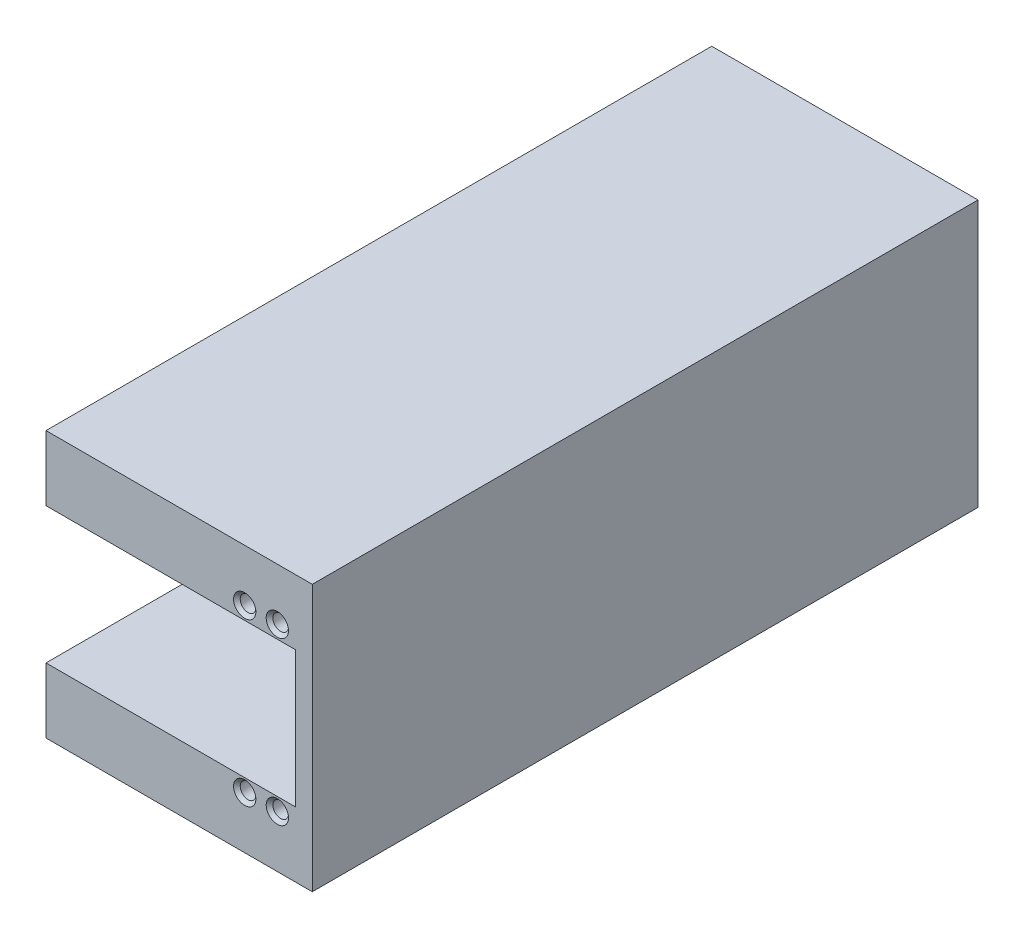
ISO-10303-21;
HEADER;
FILE_DESCRIPTION(('STEP AP214'),'2;1');
FILE_NAME('part.step','',(''),(''),'','','');
FILE_SCHEMA(('AUTOMOTIVE_DESIGN { 1 0 10303 214 1 1 1 1 }'));
ENDSEC;
DATA;
#1=APPLICATION_CONTEXT('core data for automotive mechanical design processes');
#2=APPLICATION_PROTOCOL_DEFINITION('international standard','automotive_design',2000,#1);
#3=PRODUCT_CONTEXT('',#1,'mechanical');
#4=PRODUCT('Part','Part','',(#3));
#5=PRODUCT_RELATED_PRODUCT_CATEGORY('part','',(#4));
#6=PRODUCT_DEFINITION_FORMATION('','',#4);
#7=PRODUCT_DEFINITION_CONTEXT('part definition',#1,'design');
#8=PRODUCT_DEFINITION('design','',#6,#7);
#9=PRODUCT_DEFINITION_SHAPE('','',#8);
#10=(LENGTH_UNIT() NAMED_UNIT(*) SI_UNIT(.MILLI.,.METRE.));
#11=(NAMED_UNIT(*) PLANE_ANGLE_UNIT() SI_UNIT($,.RADIAN.));
#12=(NAMED_UNIT(*) SI_UNIT($,.STERADIAN.) SOLID_ANGLE_UNIT());
#13=UNCERTAINTY_MEASURE_WITH_UNIT(LENGTH_MEASURE(1.E-05),#10,'distance_accuracy_value','');
#14=(GEOMETRIC_REPRESENTATION_CONTEXT(3) GLOBAL_UNCERTAINTY_ASSIGNED_CONTEXT((#13)) GLOBAL_UNIT_ASSIGNED_CONTEXT((#10,
#11,#12)) REPRESENTATION_CONTEXT('',''));
#15=CARTESIAN_POINT('',(0.,0.,0.));
#16=DIRECTION('',(0.,0.,1.));
#17=DIRECTION('',(1.,0.,0.));
#18=AXIS2_PLACEMENT_3D('',#15,#16,#17);
#19=CARTESIAN_POINT('',(40.,-40.,200.));
#20=DIRECTION('',(0.,1.,0.));
#21=DIRECTION('',(0.,0.,1.));
#22=AXIS2_PLACEMENT_3D('',#19,#20,#21);
#23=PLANE('',#22);
#24=DIRECTION('',(1.,0.,0.));
#25=VECTOR('',#24,1.);
#26=CARTESIAN_POINT('',(40.,-40.,0.));
#27=LINE('',#26,#25);
#28=CARTESIAN_POINT('',(-40.,-40.,0.));
#29=VERTEX_POINT('',#28);
#30=CARTESIAN_POINT('',(40.,-40.,0.));
#31=VERTEX_POINT('',#30);
#32=EDGE_CURVE('E139',#29,#31,#27,.T.);
#33=ORIENTED_EDGE('',*,*,#32,.T.);
#34=DIRECTION('',(0.,0.,-1.));
#35=VECTOR('',#34,1.);
#36=CARTESIAN_POINT('',(40.,-40.,200.));
#37=LINE('',#36,#35);
#38=CARTESIAN_POINT('',(40.,-40.,200.));
#39=VERTEX_POINT('',#38);
#40=EDGE_CURVE('E167',#39,#31,#37,.T.);
#41=ORIENTED_EDGE('',*,*,#40,.F.);
#42=DIRECTION('',(1.,0.,0.));
#43=VECTOR('',#42,1.);
#44=CARTESIAN_POINT('',(40.,-40.,200.));
#45=LINE('',#44,#43);
#46=CARTESIAN_POINT('',(-40.,-40.,200.));
#47=VERTEX_POINT('',#46);
#48=EDGE_CURVE('E154',#47,#39,#45,.T.);
#49=ORIENTED_EDGE('',*,*,#48,.F.);
#50=DIRECTION('',(0.,0.,-1.));
#51=VECTOR('',#50,1.);
#52=CARTESIAN_POINT('',(-40.,-40.,200.));
#53=LINE('',#52,#51);
#54=EDGE_CURVE('E135',#47,#29,#53,.T.);
#55=ORIENTED_EDGE('',*,*,#54,.T.);
#56=EDGE_LOOP('',(#33,#41,#49,#55));
#57=FACE_BOUND('',#56,.T.);
#58=ADVANCED_FACE('F40',(#57),#23,.F.);
#59=CARTESIAN_POINT('',(40.,40.,200.));
#60=DIRECTION('',(-1.,0.,0.));
#61=DIRECTION('',(0.,0.,1.));
#62=AXIS2_PLACEMENT_3D('',#59,#60,#61);
#63=PLANE('',#62);
#64=DIRECTION('',(0.,1.,0.));
#65=VECTOR('',#64,1.);
#66=CARTESIAN_POINT('',(40.,40.,0.));
#67=LINE('',#66,#65);
#68=CARTESIAN_POINT('',(40.,40.,0.));
#69=VERTEX_POINT('',#68);
#70=EDGE_CURVE('E142',#31,#69,#67,.T.);
#71=ORIENTED_EDGE('',*,*,#70,.T.);
#72=DIRECTION('',(0.,0.,-1.));
#73=VECTOR('',#72,1.);
#74=CARTESIAN_POINT('',(40.,40.,200.));
#75=LINE('',#74,#73);
#76=CARTESIAN_POINT('',(40.,40.,200.));
#77=VERTEX_POINT('',#76);
#78=EDGE_CURVE('E164',#77,#69,#75,.T.);
#79=ORIENTED_EDGE('',*,*,#78,.F.);
#80=DIRECTION('',(0.,1.,0.));
#81=VECTOR('',#80,1.);
#82=CARTESIAN_POINT('',(40.,40.,200.));
#83=LINE('',#82,#81);
#84=EDGE_CURVE('E102',#39,#77,#83,.T.);
#85=ORIENTED_EDGE('',*,*,#84,.F.);
#86=ORIENTED_EDGE('',*,*,#40,.T.);
#87=EDGE_LOOP('',(#71,#79,#85,#86));
#88=FACE_BOUND('',#87,.T.);
#89=ADVANCED_FACE('F231',(#88),#63,.F.);
#90=CARTESIAN_POINT('',(-40.,40.,200.));
#91=DIRECTION('',(0.,-1.,0.));
#92=DIRECTION('',(0.,0.,-1.));
#93=AXIS2_PLACEMENT_3D('',#90,#91,#92);
#94=PLANE('',#93);
#95=DIRECTION('',(-1.,0.,0.));
#96=VECTOR('',#95,1.);
#97=CARTESIAN_POINT('',(-40.,40.,0.));
#98=LINE('',#97,#96);
#99=CARTESIAN_POINT('',(-40.,40.,0.));
#100=VERTEX_POINT('',#99);
#101=EDGE_CURVE('E145',#69,#100,#98,.T.);
#102=ORIENTED_EDGE('',*,*,#101,.T.);
#103=DIRECTION('',(0.,0.,-1.));
#104=VECTOR('',#103,1.);
#105=CARTESIAN_POINT('',(-40.,40.,200.));
#106=LINE('',#105,#104);
#107=CARTESIAN_POINT('',(-40.,40.,200.));
#108=VERTEX_POINT('',#107);
#109=EDGE_CURVE('E161',#108,#100,#106,.T.);
#110=ORIENTED_EDGE('',*,*,#109,.F.);
#111=DIRECTION('',(-1.,0.,0.));
#112=VECTOR('',#111,1.);
#113=CARTESIAN_POINT('',(-40.,40.,200.));
#114=LINE('',#113,#112);
#115=EDGE_CURVE('E313',#77,#108,#114,.T.);
#116=ORIENTED_EDGE('',*,*,#115,.F.);
#117=ORIENTED_EDGE('',*,*,#78,.T.);
#118=EDGE_LOOP('',(#102,#110,#116,#117));
#119=FACE_BOUND('',#118,.T.);
#120=ADVANCED_FACE('F237',(#119),#94,.F.);
#121=CARTESIAN_POINT('',(-40.,20.45,200.));
#122=DIRECTION('',(1.,0.,0.));
#123=DIRECTION('',(0.,1.,0.));
#124=AXIS2_PLACEMENT_3D('',#121,#122,#123);
#125=PLANE('',#124);
#126=DIRECTION('',(0.,-1.,0.));
#127=VECTOR('',#126,1.);
#128=CARTESIAN_POINT('',(-40.,20.45,0.));
#129=LINE('',#128,#127);
#130=CARTESIAN_POINT('',(-40.,20.45,0.));
#131=VERTEX_POINT('',#130);
#132=EDGE_CURVE('E147',#100,#131,#129,.T.);
#133=ORIENTED_EDGE('',*,*,#132,.T.);
#134=DIRECTION('',(0.,0.,-1.));
#135=VECTOR('',#134,1.);
#136=CARTESIAN_POINT('',(-40.,20.45,200.));
#137=LINE('',#136,#135);
#138=CARTESIAN_POINT('',(-40.,20.45,200.));
#139=VERTEX_POINT('',#138);
#140=EDGE_CURVE('E158',#139,#131,#137,.T.);
#141=ORIENTED_EDGE('',*,*,#140,.F.);
#142=DIRECTION('',(0.,-1.,0.));
#143=VECTOR('',#142,1.);
#144=CARTESIAN_POINT('',(-40.,20.45,200.));
#145=LINE('',#144,#143);
#146=EDGE_CURVE('E315',#108,#139,#145,.T.);
#147=ORIENTED_EDGE('',*,*,#146,.F.);
#148=ORIENTED_EDGE('',*,*,#109,.T.);
#149=EDGE_LOOP('',(#133,#141,#147,#148));
#150=FACE_BOUND('',#149,.T.);
#151=ADVANCED_FACE('F321',(#150),#125,.F.);
#152=CARTESIAN_POINT('',(35.,20.45,200.));
#153=DIRECTION('',(0.,1.,0.));
#154=DIRECTION('',(-1.,0.,0.));
#155=AXIS2_PLACEMENT_3D('',#152,#153,#154);
#156=PLANE('',#155);
#157=DIRECTION('',(1.,0.,0.));
#158=VECTOR('',#157,1.);
#159=CARTESIAN_POINT('',(35.,20.45,0.));
#160=LINE('',#159,#158);
#161=CARTESIAN_POINT('',(35.,20.45,0.));
#162=VERTEX_POINT('',#161);
#163=EDGE_CURVE('E149',#131,#162,#160,.T.);
#164=ORIENTED_EDGE('',*,*,#163,.T.);
#165=DIRECTION('',(0.,0.,-1.));
#166=VECTOR('',#165,1.);
#167=CARTESIAN_POINT('',(35.,20.45,200.));
#168=LINE('',#167,#166);
#169=CARTESIAN_POINT('',(35.,20.45,200.));
#170=VERTEX_POINT('',#169);
#171=EDGE_CURVE('E130',#170,#162,#168,.T.);
#172=ORIENTED_EDGE('',*,*,#171,.F.);
#173=DIRECTION('',(1.,0.,0.));
#174=VECTOR('',#173,1.);
#175=CARTESIAN_POINT('',(35.,20.45,200.));
#176=LINE('',#175,#174);
#177=EDGE_CURVE('E121',#139,#170,#176,.T.);
#178=ORIENTED_EDGE('',*,*,#177,.F.);
#179=ORIENTED_EDGE('',*,*,#140,.T.);
#180=EDGE_LOOP('',(#164,#172,#178,#179));
#181=FACE_BOUND('',#180,.T.);
#182=ADVANCED_FACE('F325',(#181),#156,.F.);
#183=CARTESIAN_POINT('',(35.,-20.45,200.));
#184=DIRECTION('',(1.,0.,0.));
#185=DIRECTION('',(0.,0.,-1.));
#186=AXIS2_PLACEMENT_3D('',#183,#184,#185);
#187=PLANE('',#186);
#188=DIRECTION('',(0.,-1.,0.));
#189=VECTOR('',#188,1.);
#190=CARTESIAN_POINT('',(35.,-20.45,0.));
#191=LINE('',#190,#189);
#192=CARTESIAN_POINT('',(35.,-20.45,0.));
#193=VERTEX_POINT('',#192);
#194=EDGE_CURVE('E129',#162,#193,#191,.T.);
#195=ORIENTED_EDGE('',*,*,#194,.T.);
#196=DIRECTION('',(0.,0.,-1.));
#197=VECTOR('',#196,1.);
#198=CARTESIAN_POINT('',(35.,-20.45,200.));
#199=LINE('',#198,#197);
#200=CARTESIAN_POINT('',(35.,-20.45,200.));
#201=VERTEX_POINT('',#200);
#202=EDGE_CURVE('E126',#201,#193,#199,.T.);
#203=ORIENTED_EDGE('',*,*,#202,.F.);
#204=DIRECTION('',(0.,-1.,0.));
#205=VECTOR('',#204,1.);
#206=CARTESIAN_POINT('',(35.,-20.45,200.));
#207=LINE('',#206,#205);
#208=EDGE_CURVE('E115',#170,#201,#207,.T.);
#209=ORIENTED_EDGE('',*,*,#208,.F.);
#210=ORIENTED_EDGE('',*,*,#171,.T.);
#211=EDGE_LOOP('',(#195,#203,#209,#210));
#212=FACE_BOUND('',#211,.T.);
#213=ADVANCED_FACE('F127',(#212),#187,.F.);
#214=CARTESIAN_POINT('',(-40.,-20.45,200.));
#215=DIRECTION('',(0.,-1.,0.));
#216=DIRECTION('',(1.,0.,0.));
#217=AXIS2_PLACEMENT_3D('',#214,#215,#216);
#218=PLANE('',#217);
#219=DIRECTION('',(-1.,0.,0.));
#220=VECTOR('',#219,1.);
#221=CARTESIAN_POINT('',(-40.,-20.45,0.));
#222=LINE('',#221,#220);
#223=CARTESIAN_POINT('',(-40.,-20.45,0.));
#224=VERTEX_POINT('',#223);
#225=EDGE_CURVE('E87',#193,#224,#222,.T.);
#226=ORIENTED_EDGE('',*,*,#225,.T.);
#227=DIRECTION('',(0.,0.,-1.));
#228=VECTOR('',#227,1.);
#229=CARTESIAN_POINT('',(-40.,-20.45,200.));
#230=LINE('',#229,#228);
#231=CARTESIAN_POINT('',(-40.,-20.45,200.));
#232=VERTEX_POINT('',#231);
#233=EDGE_CURVE('E131',#232,#224,#230,.T.);
#234=ORIENTED_EDGE('',*,*,#233,.F.);
#235=DIRECTION('',(-1.,0.,0.));
#236=VECTOR('',#235,1.);
#237=CARTESIAN_POINT('',(-40.,-20.45,200.));
#238=LINE('',#237,#236);
#239=EDGE_CURVE('E119',#201,#232,#238,.T.);
#240=ORIENTED_EDGE('',*,*,#239,.F.);
#241=ORIENTED_EDGE('',*,*,#202,.T.);
#242=EDGE_LOOP('',(#226,#234,#240,#241));
#243=FACE_BOUND('',#242,.T.);
#244=ADVANCED_FACE('F133',(#243),#218,.F.);
#245=CARTESIAN_POINT('',(-40.,-40.,200.));
#246=DIRECTION('',(1.,0.,0.));
#247=DIRECTION('',(0.,1.,0.));
#248=AXIS2_PLACEMENT_3D('',#245,#246,#247);
#249=PLANE('',#248);
#250=DIRECTION('',(0.,-1.,0.));
#251=VECTOR('',#250,1.);
#252=CARTESIAN_POINT('',(-40.,-40.,0.));
#253=LINE('',#252,#251);
#254=EDGE_CURVE('E93',#224,#29,#253,.T.);
#255=ORIENTED_EDGE('',*,*,#254,.T.);
#256=ORIENTED_EDGE('',*,*,#54,.F.);
#257=DIRECTION('',(0.,-1.,0.));
#258=VECTOR('',#257,1.);
#259=CARTESIAN_POINT('',(-40.,-40.,200.));
#260=LINE('',#259,#258);
#261=EDGE_CURVE('E58',#232,#47,#260,.T.);
#262=ORIENTED_EDGE('',*,*,#261,.F.);
#263=ORIENTED_EDGE('',*,*,#233,.T.);
#264=EDGE_LOOP('',(#255,#256,#262,#263));
#265=FACE_BOUND('',#264,.T.);
#266=ADVANCED_FACE('F332',(#265),#249,.F.);
#267=CARTESIAN_POINT('',(0.,0.,200.));
#268=DIRECTION('',(0.,0.,-1.));
#269=DIRECTION('',(-1.,0.,0.));
#270=AXIS2_PLACEMENT_3D('',#267,#268,#269);
#271=PLANE('',#270);
#272=CARTESIAN_POINT('',(29.4999999999995,-24.3399999999998,200.));
#273=DIRECTION('',(0.,0.,-1.));
#274=DIRECTION('',(-1.,0.,0.));
#275=AXIS2_PLACEMENT_3D('',#272,#273,#274);
#276=CIRCLE('',#275,3.34999999999999);
#277=CARTESIAN_POINT('',(26.1499999999995,-24.3399999999998,200.));
#278=VERTEX_POINT('',#277);
#279=EDGE_CURVE('E205',#278,#278,#276,.T.);
#280=ORIENTED_EDGE('',*,*,#279,.T.);
#281=EDGE_LOOP('',(#280));
#282=FACE_BOUND('',#281,.T.);
#283=CARTESIAN_POINT('',(19.6999999999995,-24.3399999999996,200.));
#284=DIRECTION('',(0.,0.,-1.));
#285=DIRECTION('',(-1.,0.,0.));
#286=AXIS2_PLACEMENT_3D('',#283,#284,#285);
#287=CIRCLE('',#286,3.34999999999999);
#288=CARTESIAN_POINT('',(16.3499999999995,-24.3399999999996,200.));
#289=VERTEX_POINT('',#288);
#290=EDGE_CURVE('E202',#289,#289,#287,.T.);
#291=ORIENTED_EDGE('',*,*,#290,.T.);
#292=EDGE_LOOP('',(#291));
#293=FACE_BOUND('',#292,.T.);
#294=CARTESIAN_POINT('',(19.7,24.34,200.));
#295=DIRECTION('',(0.,0.,-1.));
#296=DIRECTION('',(-1.,0.,0.));
#297=AXIS2_PLACEMENT_3D('',#294,#295,#296);
#298=CIRCLE('',#297,3.34999999999999);
#299=CARTESIAN_POINT('',(16.35,24.34,200.));
#300=VERTEX_POINT('',#299);
#301=EDGE_CURVE('E199',#300,#300,#298,.T.);
#302=ORIENTED_EDGE('',*,*,#301,.T.);
#303=EDGE_LOOP('',(#302));
#304=FACE_BOUND('',#303,.T.);
#305=CARTESIAN_POINT('',(29.5,24.34,200.));
#306=DIRECTION('',(0.,0.,-1.));
#307=DIRECTION('',(-1.,0.,0.));
#308=AXIS2_PLACEMENT_3D('',#305,#306,#307);
#309=CIRCLE('',#308,3.34999999999999);
#310=CARTESIAN_POINT('',(26.15,24.34,200.));
#311=VERTEX_POINT('',#310);
#312=EDGE_CURVE('E196',#311,#311,#309,.T.);
#313=ORIENTED_EDGE('',*,*,#312,.T.);
#314=EDGE_LOOP('',(#313));
#315=FACE_BOUND('',#314,.T.);
#316=ORIENTED_EDGE('',*,*,#48,.T.);
#317=ORIENTED_EDGE('',*,*,#84,.T.);
#318=ORIENTED_EDGE('',*,*,#115,.T.);
#319=ORIENTED_EDGE('',*,*,#146,.T.);
#320=ORIENTED_EDGE('',*,*,#177,.T.);
#321=ORIENTED_EDGE('',*,*,#208,.T.);
#322=ORIENTED_EDGE('',*,*,#239,.T.);
#323=ORIENTED_EDGE('',*,*,#261,.T.);
#324=EDGE_LOOP('',(#316,#317,#318,#319,#320,#321,#322,#323));
#325=FACE_BOUND('',#324,.T.);
#326=ADVANCED_FACE('F117',(#282,#293,#304,#315,#325),#271,.F.);
#327=CARTESIAN_POINT('',(0.,0.,0.));
#328=DIRECTION('',(0.,0.,-1.));
#329=DIRECTION('',(-1.,0.,0.));
#330=AXIS2_PLACEMENT_3D('',#327,#328,#329);
#331=PLANE('',#330);
#332=CARTESIAN_POINT('',(19.6999999999995,-24.3399999999996,0.));
#333=DIRECTION('',(0.,0.,-1.));
#334=DIRECTION('',(-1.,0.,0.));
#335=AXIS2_PLACEMENT_3D('',#332,#333,#334);
#336=CIRCLE('',#335,3.34999999999999);
#337=CARTESIAN_POINT('',(16.3499999999995,-24.3399999999996,0.));
#338=VERTEX_POINT('',#337);
#339=EDGE_CURVE('E181',#338,#338,#336,.F.);
#340=ORIENTED_EDGE('',*,*,#339,.T.);
#341=EDGE_LOOP('',(#340));
#342=FACE_BOUND('',#341,.T.);
#343=CARTESIAN_POINT('',(29.4999999999995,-24.3399999999998,0.));
#344=DIRECTION('',(0.,0.,-1.));
#345=DIRECTION('',(-1.,0.,0.));
#346=AXIS2_PLACEMENT_3D('',#343,#344,#345);
#347=CIRCLE('',#346,3.34999999999996);
#348=CARTESIAN_POINT('',(26.1499999999995,-24.3399999999998,0.));
#349=VERTEX_POINT('',#348);
#350=EDGE_CURVE('E178',#349,#349,#347,.F.);
#351=ORIENTED_EDGE('',*,*,#350,.T.);
#352=EDGE_LOOP('',(#351));
#353=FACE_BOUND('',#352,.T.);
#354=CARTESIAN_POINT('',(29.5,24.34,0.));
#355=DIRECTION('',(0.,0.,-1.));
#356=DIRECTION('',(-1.,0.,0.));
#357=AXIS2_PLACEMENT_3D('',#354,#355,#356);
#358=CIRCLE('',#357,3.35000000000005);
#359=CARTESIAN_POINT('',(26.15,24.34,0.));
#360=VERTEX_POINT('',#359);
#361=EDGE_CURVE('E175',#360,#360,#358,.F.);
#362=ORIENTED_EDGE('',*,*,#361,.T.);
#363=EDGE_LOOP('',(#362));
#364=FACE_BOUND('',#363,.T.);
#365=CARTESIAN_POINT('',(19.7,24.34,0.));
#366=DIRECTION('',(0.,0.,-1.));
#367=DIRECTION('',(-1.,0.,0.));
#368=AXIS2_PLACEMENT_3D('',#365,#366,#367);
#369=CIRCLE('',#368,3.34999999999999);
#370=CARTESIAN_POINT('',(16.35,24.34,0.));
#371=VERTEX_POINT('',#370);
#372=EDGE_CURVE('E172',#371,#371,#369,.F.);
#373=ORIENTED_EDGE('',*,*,#372,.T.);
#374=EDGE_LOOP('',(#373));
#375=FACE_BOUND('',#374,.T.);
#376=ORIENTED_EDGE('',*,*,#32,.F.);
#377=ORIENTED_EDGE('',*,*,#254,.F.);
#378=ORIENTED_EDGE('',*,*,#225,.F.);
#379=ORIENTED_EDGE('',*,*,#194,.F.);
#380=ORIENTED_EDGE('',*,*,#163,.F.);
#381=ORIENTED_EDGE('',*,*,#132,.F.);
#382=ORIENTED_EDGE('',*,*,#101,.F.);
#383=ORIENTED_EDGE('',*,*,#70,.F.);
#384=EDGE_LOOP('',(#376,#377,#378,#379,#380,#381,#382,#383));
#385=FACE_BOUND('',#384,.T.);
#386=ADVANCED_FACE('F328',(#342,#353,#364,#375,#385),#331,.T.);
#387=CARTESIAN_POINT('',(29.5,24.34,192.));
#388=DIRECTION('',(0.,0.,1.));
#389=DIRECTION('',(1.,0.,0.));
#390=AXIS2_PLACEMENT_3D('',#387,#388,#389);
#391=CYLINDRICAL_SURFACE('',#390,2.35);
#392=CARTESIAN_POINT('',(29.5,24.34,199.));
#393=DIRECTION('',(0.,0.,-1.));
#394=DIRECTION('',(-1.,0.,0.));
#395=AXIS2_PLACEMENT_3D('',#392,#393,#394);
#396=CIRCLE('',#395,2.35);
#397=CARTESIAN_POINT('',(27.15,24.34,199.));
#398=VERTEX_POINT('',#397);
#399=EDGE_CURVE('E11',#398,#398,#396,.F.);
#400=ORIENTED_EDGE('',*,*,#399,.T.);
#401=EDGE_LOOP('',(#400));
#402=FACE_BOUND('',#401,.T.);
#403=CARTESIAN_POINT('',(29.5,24.34,192.));
#404=DIRECTION('',(0.,0.,1.));
#405=DIRECTION('',(1.,0.,0.));
#406=AXIS2_PLACEMENT_3D('',#403,#404,#405);
#407=CIRCLE('',#406,2.35);
#408=CARTESIAN_POINT('',(31.85,24.34,192.));
#409=VERTEX_POINT('',#408);
#410=EDGE_CURVE('E143',#409,#409,#407,.T.);
#411=ORIENTED_EDGE('',*,*,#410,.F.);
#412=EDGE_LOOP('',(#411));
#413=FACE_BOUND('',#412,.T.);
#414=ADVANCED_FACE('F397',(#402,#413),#391,.F.);
#415=CARTESIAN_POINT('',(29.5,24.34,192.));
#416=DIRECTION('',(0.,0.,1.));
#417=DIRECTION('',(1.,0.,0.));
#418=AXIS2_PLACEMENT_3D('',#415,#416,#417);
#419=PLANE('',#418);
#420=ORIENTED_EDGE('',*,*,#410,.T.);
#421=EDGE_LOOP('',(#420));
#422=FACE_BOUND('',#421,.T.);
#423=ADVANCED_FACE('F406',(#422),#419,.T.);
#424=CARTESIAN_POINT('',(19.7,24.34,192.));
#425=DIRECTION('',(0.,0.,1.));
#426=DIRECTION('',(1.,0.,0.));
#427=AXIS2_PLACEMENT_3D('',#424,#425,#426);
#428=CYLINDRICAL_SURFACE('',#427,2.35);
#429=CARTESIAN_POINT('',(19.7,24.34,199.));
#430=DIRECTION('',(0.,0.,-1.));
#431=DIRECTION('',(-1.,0.,0.));
#432=AXIS2_PLACEMENT_3D('',#429,#430,#431);
#433=CIRCLE('',#432,2.35);
#434=CARTESIAN_POINT('',(17.35,24.34,199.));
#435=VERTEX_POINT('',#434);
#436=EDGE_CURVE('E50',#435,#435,#433,.F.);
#437=ORIENTED_EDGE('',*,*,#436,.T.);
#438=EDGE_LOOP('',(#437));
#439=FACE_BOUND('',#438,.T.);
#440=CARTESIAN_POINT('',(19.7,24.34,192.));
#441=DIRECTION('',(0.,0.,1.));
#442=DIRECTION('',(-1.,0.,0.));
#443=AXIS2_PLACEMENT_3D('',#440,#441,#442);
#444=CIRCLE('',#443,2.35);
#445=CARTESIAN_POINT('',(17.35,24.34,192.));
#446=VERTEX_POINT('',#445);
#447=EDGE_CURVE('E302',#446,#446,#444,.T.);
#448=ORIENTED_EDGE('',*,*,#447,.F.);
#449=EDGE_LOOP('',(#448));
#450=FACE_BOUND('',#449,.T.);
#451=ADVANCED_FACE('F213',(#439,#450),#428,.F.);
#452=CARTESIAN_POINT('',(19.7,24.34,192.));
#453=DIRECTION('',(0.,0.,-1.));
#454=DIRECTION('',(-1.,0.,0.));
#455=AXIS2_PLACEMENT_3D('',#452,#453,#454);
#456=PLANE('',#455);
#457=ORIENTED_EDGE('',*,*,#447,.T.);
#458=EDGE_LOOP('',(#457));
#459=FACE_BOUND('',#458,.T.);
#460=ADVANCED_FACE('F425',(#459),#456,.F.);
#461=CARTESIAN_POINT('',(19.6999999999995,-24.3399999999996,192.));
#462=DIRECTION('',(0.,0.,1.));
#463=DIRECTION('',(1.,0.,0.));
#464=AXIS2_PLACEMENT_3D('',#461,#462,#463);
#465=CYLINDRICAL_SURFACE('',#464,2.35);
#466=CARTESIAN_POINT('',(19.6999999999995,-24.3399999999996,199.));
#467=DIRECTION('',(0.,0.,-1.));
#468=DIRECTION('',(-1.,0.,0.));
#469=AXIS2_PLACEMENT_3D('',#466,#467,#468);
#470=CIRCLE('',#469,2.35);
#471=CARTESIAN_POINT('',(17.3499999999995,-24.3399999999996,199.));
#472=VERTEX_POINT('',#471);
#473=EDGE_CURVE('E208',#472,#472,#470,.F.);
#474=ORIENTED_EDGE('',*,*,#473,.T.);
#475=EDGE_LOOP('',(#474));
#476=FACE_BOUND('',#475,.T.);
#477=CARTESIAN_POINT('',(19.6999999999995,-24.3399999999996,192.));
#478=DIRECTION('',(0.,0.,1.));
#479=DIRECTION('',(1.,0.,0.));
#480=AXIS2_PLACEMENT_3D('',#477,#478,#479);
#481=CIRCLE('',#480,2.35);
#482=CARTESIAN_POINT('',(22.0499999999995,-24.3399999999996,192.));
#483=VERTEX_POINT('',#482);
#484=EDGE_CURVE('E298',#483,#483,#481,.T.);
#485=ORIENTED_EDGE('',*,*,#484,.F.);
#486=EDGE_LOOP('',(#485));
#487=FACE_BOUND('',#486,.T.);
#488=ADVANCED_FACE('F434',(#476,#487),#465,.F.);
#489=CARTESIAN_POINT('',(19.6999999999995,-24.3399999999996,192.));
#490=DIRECTION('',(0.,0.,1.));
#491=DIRECTION('',(1.,0.,0.));
#492=AXIS2_PLACEMENT_3D('',#489,#490,#491);
#493=PLANE('',#492);
#494=ORIENTED_EDGE('',*,*,#484,.T.);
#495=EDGE_LOOP('',(#494));
#496=FACE_BOUND('',#495,.T.);
#497=ADVANCED_FACE('F292',(#496),#493,.T.);
#498=CARTESIAN_POINT('',(29.4999999999995,-24.3399999999998,192.));
#499=DIRECTION('',(0.,0.,1.));
#500=DIRECTION('',(1.,0.,0.));
#501=AXIS2_PLACEMENT_3D('',#498,#499,#500);
#502=CYLINDRICAL_SURFACE('',#501,2.35);
#503=CARTESIAN_POINT('',(29.4999999999995,-24.3399999999998,199.));
#504=DIRECTION('',(0.,0.,-1.));
#505=DIRECTION('',(-1.,0.,0.));
#506=AXIS2_PLACEMENT_3D('',#503,#504,#505);
#507=CIRCLE('',#506,2.35);
#508=CARTESIAN_POINT('',(27.1499999999995,-24.3399999999998,199.));
#509=VERTEX_POINT('',#508);
#510=EDGE_CURVE('E193',#509,#509,#507,.F.);
#511=ORIENTED_EDGE('',*,*,#510,.T.);
#512=EDGE_LOOP('',(#511));
#513=FACE_BOUND('',#512,.T.);
#514=CARTESIAN_POINT('',(29.4999999999995,-24.3399999999998,192.));
#515=DIRECTION('',(0.,0.,1.));
#516=DIRECTION('',(-1.,0.,0.));
#517=AXIS2_PLACEMENT_3D('',#514,#515,#516);
#518=CIRCLE('',#517,2.35);
#519=CARTESIAN_POINT('',(27.1499999999995,-24.3399999999998,192.));
#520=VERTEX_POINT('',#519);
#521=EDGE_CURVE('E296',#520,#520,#518,.T.);
#522=ORIENTED_EDGE('',*,*,#521,.F.);
#523=EDGE_LOOP('',(#522));
#524=FACE_BOUND('',#523,.T.);
#525=ADVANCED_FACE('F288',(#513,#524),#502,.F.);
#526=CARTESIAN_POINT('',(29.4999999999995,-24.3399999999998,192.));
#527=DIRECTION('',(0.,0.,-1.));
#528=DIRECTION('',(-1.,0.,0.));
#529=AXIS2_PLACEMENT_3D('',#526,#527,#528);
#530=PLANE('',#529);
#531=ORIENTED_EDGE('',*,*,#521,.T.);
#532=EDGE_LOOP('',(#531));
#533=FACE_BOUND('',#532,.T.);
#534=ADVANCED_FACE('F291',(#533),#530,.F.);
#535=CARTESIAN_POINT('',(29.5,24.34,8.));
#536=DIRECTION('',(0.,0.,-1.));
#537=DIRECTION('',(-1.,0.,0.));
#538=AXIS2_PLACEMENT_3D('',#535,#536,#537);
#539=CYLINDRICAL_SURFACE('',#538,2.35);
#540=CARTESIAN_POINT('',(29.5,24.34,1.00000000000003));
#541=DIRECTION('',(0.,0.,-1.));
#542=DIRECTION('',(-1.,0.,0.));
#543=AXIS2_PLACEMENT_3D('',#540,#541,#542);
#544=CIRCLE('',#543,2.35);
#545=CARTESIAN_POINT('',(27.15,24.34,1.00000000000003));
#546=VERTEX_POINT('',#545);
#547=EDGE_CURVE('E187',#546,#546,#544,.T.);
#548=ORIENTED_EDGE('',*,*,#547,.T.);
#549=EDGE_LOOP('',(#548));
#550=FACE_BOUND('',#549,.T.);
#551=CARTESIAN_POINT('',(29.5,24.34,8.));
#552=DIRECTION('',(0.,0.,-1.));
#553=DIRECTION('',(-1.,0.,0.));
#554=AXIS2_PLACEMENT_3D('',#551,#552,#553);
#555=CIRCLE('',#554,2.35);
#556=CARTESIAN_POINT('',(27.15,24.34,8.));
#557=VERTEX_POINT('',#556);
#558=EDGE_CURVE('E299',#557,#557,#555,.T.);
#559=ORIENTED_EDGE('',*,*,#558,.F.);
#560=EDGE_LOOP('',(#559));
#561=FACE_BOUND('',#560,.T.);
#562=ADVANCED_FACE('F468',(#550,#561),#539,.F.);
#563=CARTESIAN_POINT('',(29.5,24.34,8.));
#564=DIRECTION('',(0.,0.,-1.));
#565=DIRECTION('',(-1.,0.,0.));
#566=AXIS2_PLACEMENT_3D('',#563,#564,#565);
#567=PLANE('',#566);
#568=ORIENTED_EDGE('',*,*,#558,.T.);
#569=EDGE_LOOP('',(#568));
#570=FACE_BOUND('',#569,.T.);
#571=ADVANCED_FACE('F477',(#570),#567,.T.);
#572=CARTESIAN_POINT('',(19.7,24.34,8.));
#573=DIRECTION('',(0.,0.,-1.));
#574=DIRECTION('',(-1.,0.,0.));
#575=AXIS2_PLACEMENT_3D('',#572,#573,#574);
#576=CYLINDRICAL_SURFACE('',#575,2.35);
#577=CARTESIAN_POINT('',(19.7,24.34,0.999999999999971));
#578=DIRECTION('',(0.,0.,-1.));
#579=DIRECTION('',(-1.,0.,0.));
#580=AXIS2_PLACEMENT_3D('',#577,#578,#579);
#581=CIRCLE('',#580,2.35);
#582=CARTESIAN_POINT('',(17.35,24.34,0.999999999999971));
#583=VERTEX_POINT('',#582);
#584=EDGE_CURVE('E190',#583,#583,#581,.T.);
#585=ORIENTED_EDGE('',*,*,#584,.T.);
#586=EDGE_LOOP('',(#585));
#587=FACE_BOUND('',#586,.T.);
#588=CARTESIAN_POINT('',(19.7,24.34,8.));
#589=DIRECTION('',(0.,0.,-1.));
#590=DIRECTION('',(1.,0.,0.));
#591=AXIS2_PLACEMENT_3D('',#588,#589,#590);
#592=CIRCLE('',#591,2.35);
#593=CARTESIAN_POINT('',(22.05,24.34,8.));
#594=VERTEX_POINT('',#593);
#595=EDGE_CURVE('E305',#594,#594,#592,.T.);
#596=ORIENTED_EDGE('',*,*,#595,.F.);
#597=EDGE_LOOP('',(#596));
#598=FACE_BOUND('',#597,.T.);
#599=ADVANCED_FACE('F487',(#587,#598),#576,.F.);
#600=CARTESIAN_POINT('',(19.7,24.34,8.));
#601=DIRECTION('',(0.,0.,1.));
#602=DIRECTION('',(1.,0.,0.));
#603=AXIS2_PLACEMENT_3D('',#600,#601,#602);
#604=PLANE('',#603);
#605=ORIENTED_EDGE('',*,*,#595,.T.);
#606=EDGE_LOOP('',(#605));
#607=FACE_BOUND('',#606,.T.);
#608=ADVANCED_FACE('F497',(#607),#604,.F.);
#609=CARTESIAN_POINT('',(19.6999999999995,-24.3399999999996,8.));
#610=DIRECTION('',(0.,0.,-1.));
#611=DIRECTION('',(-1.,0.,0.));
#612=AXIS2_PLACEMENT_3D('',#609,#610,#611);
#613=CYLINDRICAL_SURFACE('',#612,2.35);
#614=CARTESIAN_POINT('',(19.6999999999995,-24.3399999999996,0.999999999999971));
#615=DIRECTION('',(0.,0.,-1.));
#616=DIRECTION('',(-1.,0.,0.));
#617=AXIS2_PLACEMENT_3D('',#614,#615,#616);
#618=CIRCLE('',#617,2.35);
#619=CARTESIAN_POINT('',(17.3499999999995,-24.3399999999996,0.999999999999971));
#620=VERTEX_POINT('',#619);
#621=EDGE_CURVE('E169',#620,#620,#618,.T.);
#622=ORIENTED_EDGE('',*,*,#621,.T.);
#623=EDGE_LOOP('',(#622));
#624=FACE_BOUND('',#623,.T.);
#625=CARTESIAN_POINT('',(19.6999999999995,-24.3399999999996,8.));
#626=DIRECTION('',(0.,0.,-1.));
#627=DIRECTION('',(-1.,0.,0.));
#628=AXIS2_PLACEMENT_3D('',#625,#626,#627);
#629=CIRCLE('',#628,2.35);
#630=CARTESIAN_POINT('',(17.3499999999995,-24.3399999999996,8.));
#631=VERTEX_POINT('',#630);
#632=EDGE_CURVE('E595',#631,#631,#629,.T.);
#633=ORIENTED_EDGE('',*,*,#632,.F.);
#634=EDGE_LOOP('',(#633));
#635=FACE_BOUND('',#634,.T.);
#636=ADVANCED_FACE('F507',(#624,#635),#613,.F.);
#637=CARTESIAN_POINT('',(19.6999999999995,-24.3399999999996,8.));
#638=DIRECTION('',(0.,0.,-1.));
#639=DIRECTION('',(-1.,0.,0.));
#640=AXIS2_PLACEMENT_3D('',#637,#638,#639);
#641=PLANE('',#640);
#642=ORIENTED_EDGE('',*,*,#632,.T.);
#643=EDGE_LOOP('',(#642));
#644=FACE_BOUND('',#643,.T.);
#645=ADVANCED_FACE('F517',(#644),#641,.T.);
#646=CARTESIAN_POINT('',(29.4999999999995,-24.3399999999998,8.));
#647=DIRECTION('',(0.,0.,-1.));
#648=DIRECTION('',(-1.,0.,0.));
#649=AXIS2_PLACEMENT_3D('',#646,#647,#648);
#650=CYLINDRICAL_SURFACE('',#649,2.35);
#651=CARTESIAN_POINT('',(29.4999999999995,-24.3399999999998,0.999999999999973));
#652=DIRECTION('',(0.,0.,-1.));
#653=DIRECTION('',(-1.,0.,0.));
#654=AXIS2_PLACEMENT_3D('',#651,#652,#653);
#655=CIRCLE('',#654,2.35);
#656=CARTESIAN_POINT('',(27.1499999999995,-24.3399999999998,0.999999999999973));
#657=VERTEX_POINT('',#656);
#658=EDGE_CURVE('E184',#657,#657,#655,.T.);
#659=ORIENTED_EDGE('',*,*,#658,.T.);
#660=EDGE_LOOP('',(#659));
#661=FACE_BOUND('',#660,.T.);
#662=CARTESIAN_POINT('',(29.4999999999995,-24.3399999999998,8.));
#663=DIRECTION('',(0.,0.,-1.));
#664=DIRECTION('',(1.,0.,0.));
#665=AXIS2_PLACEMENT_3D('',#662,#663,#664);
#666=CIRCLE('',#665,2.35);
#667=CARTESIAN_POINT('',(31.8499999999995,-24.3399999999998,8.));
#668=VERTEX_POINT('',#667);
#669=EDGE_CURVE('E593',#668,#668,#666,.T.);
#670=ORIENTED_EDGE('',*,*,#669,.F.);
#671=EDGE_LOOP('',(#670));
#672=FACE_BOUND('',#671,.T.);
#673=ADVANCED_FACE('F527',(#661,#672),#650,.F.);
#674=CARTESIAN_POINT('',(29.4999999999995,-24.3399999999998,8.));
#675=DIRECTION('',(0.,0.,1.));
#676=DIRECTION('',(1.,0.,0.));
#677=AXIS2_PLACEMENT_3D('',#674,#675,#676);
#678=PLANE('',#677);
#679=ORIENTED_EDGE('',*,*,#669,.T.);
#680=EDGE_LOOP('',(#679));
#681=FACE_BOUND('',#680,.T.);
#682=ADVANCED_FACE('F249',(#681),#678,.F.);
#683=CARTESIAN_POINT('',(19.6999999999995,-24.3399999999996,0.999999999999971));
#684=DIRECTION('',(0.,0.,-1.));
#685=DIRECTION('',(-1.,0.,0.));
#686=AXIS2_PLACEMENT_3D('',#683,#684,#685);
#687=CONICAL_SURFACE('',#686,2.35,0.785398163397458);
#688=ORIENTED_EDGE('',*,*,#339,.F.);
#689=EDGE_LOOP('',(#688));
#690=FACE_BOUND('',#689,.T.);
#691=ORIENTED_EDGE('',*,*,#621,.F.);
#692=EDGE_LOOP('',(#691));
#693=FACE_BOUND('',#692,.T.);
#694=ADVANCED_FACE('F242',(#690,#693),#687,.F.);
#695=CARTESIAN_POINT('',(29.4999999999995,-24.3399999999998,0.999999999999973));
#696=DIRECTION('',(0.,0.,-1.));
#697=DIRECTION('',(-1.,0.,0.));
#698=AXIS2_PLACEMENT_3D('',#695,#696,#697);
#699=CONICAL_SURFACE('',#698,2.35,0.785398163397444);
#700=ORIENTED_EDGE('',*,*,#350,.F.);
#701=EDGE_LOOP('',(#700));
#702=FACE_BOUND('',#701,.T.);
#703=ORIENTED_EDGE('',*,*,#658,.F.);
#704=EDGE_LOOP('',(#703));
#705=FACE_BOUND('',#704,.T.);
#706=ADVANCED_FACE('F248',(#702,#705),#699,.F.);
#707=CARTESIAN_POINT('',(29.5,24.34,1.00000000000003));
#708=DIRECTION('',(0.,0.,-1.));
#709=DIRECTION('',(-1.,0.,0.));
#710=AXIS2_PLACEMENT_3D('',#707,#708,#709);
#711=CONICAL_SURFACE('',#710,2.35,0.785398163397458);
#712=ORIENTED_EDGE('',*,*,#361,.F.);
#713=EDGE_LOOP('',(#712));
#714=FACE_BOUND('',#713,.T.);
#715=ORIENTED_EDGE('',*,*,#547,.F.);
#716=EDGE_LOOP('',(#715));
#717=FACE_BOUND('',#716,.T.);
#718=ADVANCED_FACE('F256',(#714,#717),#711,.F.);
#719=CARTESIAN_POINT('',(19.7,24.34,0.999999999999971));
#720=DIRECTION('',(0.,0.,-1.));
#721=DIRECTION('',(-1.,0.,0.));
#722=AXIS2_PLACEMENT_3D('',#719,#720,#721);
#723=CONICAL_SURFACE('',#722,2.35,0.785398163397458);
#724=ORIENTED_EDGE('',*,*,#372,.F.);
#725=EDGE_LOOP('',(#724));
#726=FACE_BOUND('',#725,.T.);
#727=ORIENTED_EDGE('',*,*,#584,.F.);
#728=EDGE_LOOP('',(#727));
#729=FACE_BOUND('',#728,.T.);
#730=ADVANCED_FACE('F263',(#726,#729),#723,.F.);
#731=CARTESIAN_POINT('',(29.4999999999995,-24.3399999999998,199.));
#732=DIRECTION('',(0.,0.,1.));
#733=DIRECTION('',(1.,0.,0.));
#734=AXIS2_PLACEMENT_3D('',#731,#732,#733);
#735=CONICAL_SURFACE('',#734,2.35,0.785398163397444);
#736=ORIENTED_EDGE('',*,*,#279,.F.);
#737=EDGE_LOOP('',(#736));
#738=FACE_BOUND('',#737,.T.);
#739=ORIENTED_EDGE('',*,*,#510,.F.);
#740=EDGE_LOOP('',(#739));
#741=FACE_BOUND('',#740,.T.);
#742=ADVANCED_FACE('F225',(#738,#741),#735,.F.);
#743=CARTESIAN_POINT('',(19.6999999999995,-24.3399999999996,199.));
#744=DIRECTION('',(0.,0.,1.));
#745=DIRECTION('',(1.,0.,0.));
#746=AXIS2_PLACEMENT_3D('',#743,#744,#745);
#747=CONICAL_SURFACE('',#746,2.35,0.785398163397432);
#748=ORIENTED_EDGE('',*,*,#290,.F.);
#749=EDGE_LOOP('',(#748));
#750=FACE_BOUND('',#749,.T.);
#751=ORIENTED_EDGE('',*,*,#473,.F.);
#752=EDGE_LOOP('',(#751));
#753=FACE_BOUND('',#752,.T.);
#754=ADVANCED_FACE('F218',(#750,#753),#747,.F.);
#755=CARTESIAN_POINT('',(19.7,24.34,199.));
#756=DIRECTION('',(0.,0.,1.));
#757=DIRECTION('',(1.,0.,0.));
#758=AXIS2_PLACEMENT_3D('',#755,#756,#757);
#759=CONICAL_SURFACE('',#758,2.35,0.785398163397445);
#760=ORIENTED_EDGE('',*,*,#301,.F.);
#761=EDGE_LOOP('',(#760));
#762=FACE_BOUND('',#761,.T.);
#763=ORIENTED_EDGE('',*,*,#436,.F.);
#764=EDGE_LOOP('',(#763));
#765=FACE_BOUND('',#764,.T.);
#766=ADVANCED_FACE('F216',(#762,#765),#759,.F.);
#767=CARTESIAN_POINT('',(29.5,24.34,199.));
#768=DIRECTION('',(0.,0.,1.));
#769=DIRECTION('',(1.,0.,0.));
#770=AXIS2_PLACEMENT_3D('',#767,#768,#769);
#771=CONICAL_SURFACE('',#770,2.35,0.785398163397445);
#772=ORIENTED_EDGE('',*,*,#312,.F.);
#773=EDGE_LOOP('',(#772));
#774=FACE_BOUND('',#773,.T.);
#775=ORIENTED_EDGE('',*,*,#399,.F.);
#776=EDGE_LOOP('',(#775));
#777=FACE_BOUND('',#776,.T.);
#778=ADVANCED_FACE('F43',(#774,#777),#771,.F.);
#779=CLOSED_SHELL('',(#58,#89,#120,#151,#182,#213,#244,#266,#326,#386,#414,#423,#451,#460,#488,
#497,#525,#534,#562,#571,#599,#608,#636,#645,#673,#682,#694,#706,#718,#730,#742,#754,#766,#778));
#780=MANIFOLD_SOLID_BREP('B2',#779);
#781=ADVANCED_BREP_SHAPE_REPRESENTATION('',(#18,#780),#14);
#782=SHAPE_DEFINITION_REPRESENTATION(#9,#781);
ENDSEC;
END-ISO-10303-21;
